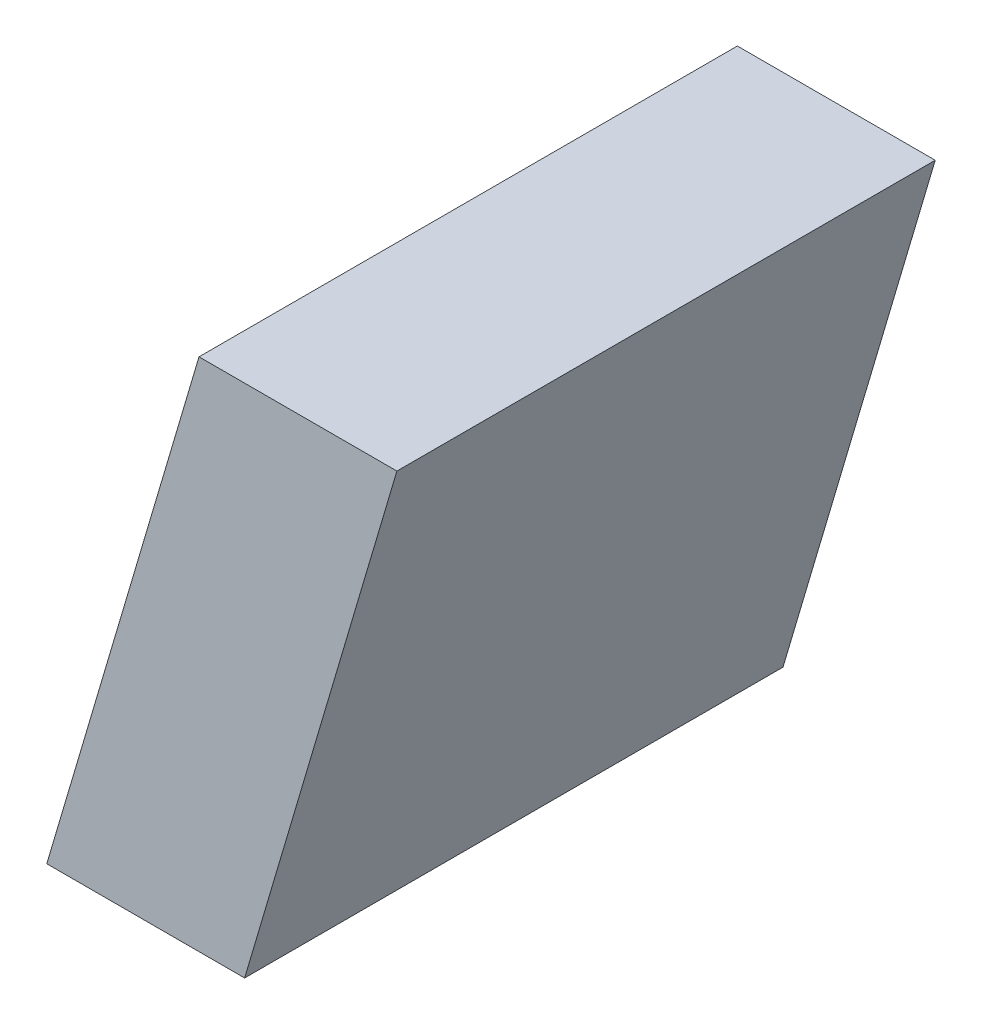
ISO-10303-21;
HEADER;
FILE_DESCRIPTION(('STEP AP214'),'2;1');
FILE_NAME('part.step','',(''),(''),'','','');
FILE_SCHEMA(('AUTOMOTIVE_DESIGN { 1 0 10303 214 1 1 1 1 }'));
ENDSEC;
DATA;
#1=APPLICATION_CONTEXT('core data for automotive mechanical design processes');
#2=APPLICATION_PROTOCOL_DEFINITION('international standard','automotive_design',2000,#1);
#3=PRODUCT_CONTEXT('',#1,'mechanical');
#4=PRODUCT('Part','Part','',(#3));
#5=PRODUCT_RELATED_PRODUCT_CATEGORY('part','',(#4));
#6=PRODUCT_DEFINITION_FORMATION('','',#4);
#7=PRODUCT_DEFINITION_CONTEXT('part definition',#1,'design');
#8=PRODUCT_DEFINITION('design','',#6,#7);
#9=PRODUCT_DEFINITION_SHAPE('','',#8);
#10=(LENGTH_UNIT() NAMED_UNIT(*) SI_UNIT(.MILLI.,.METRE.));
#11=(NAMED_UNIT(*) PLANE_ANGLE_UNIT() SI_UNIT($,.RADIAN.));
#12=(NAMED_UNIT(*) SI_UNIT($,.STERADIAN.) SOLID_ANGLE_UNIT());
#13=UNCERTAINTY_MEASURE_WITH_UNIT(LENGTH_MEASURE(1.E-05),#10,'distance_accuracy_value','');
#14=(GEOMETRIC_REPRESENTATION_CONTEXT(3) GLOBAL_UNCERTAINTY_ASSIGNED_CONTEXT((#13)) GLOBAL_UNIT_ASSIGNED_CONTEXT((#10,
#11,#12)) REPRESENTATION_CONTEXT('',''));
#15=CARTESIAN_POINT('',(0.,0.,0.));
#16=DIRECTION('',(0.,0.,1.));
#17=DIRECTION('',(1.,0.,0.));
#18=AXIS2_PLACEMENT_3D('',#15,#16,#17);
#19=CARTESIAN_POINT('',(-2.2657258471,-1.901525578586,0.));
#20=DIRECTION('',(0.,-1.,0.));
#21=DIRECTION('',(1.,0.,0.));
#22=AXIS2_PLACEMENT_3D('',#19,#20,#21);
#23=PLANE('',#22);
#24=DIRECTION('',(1.,0.,0.));
#25=VECTOR('',#24,1.);
#26=CARTESIAN_POINT('',(-2.2657258471,-1.901525578586,0.));
#27=LINE('',#26,#25);
#28=CARTESIAN_POINT('',(-2.2657258471,-1.901525578586,0.));
#29=VERTEX_POINT('',#28);
#30=CARTESIAN_POINT('',(-2.228971753874,-1.901525578586,0.));
#31=VERTEX_POINT('',#30);
#32=EDGE_CURVE('E11',#29,#31,#27,.T.);
#33=ORIENTED_EDGE('',*,*,#32,.T.);
#34=DIRECTION('',(0.,0.,1.));
#35=VECTOR('',#34,1.);
#36=CARTESIAN_POINT('',(-2.228971753874,-1.901525578586,0.));
#37=LINE('',#36,#35);
#38=CARTESIAN_POINT('',(-2.228971753874,-1.901525578586,0.1));
#39=VERTEX_POINT('',#38);
#40=EDGE_CURVE('E24',#31,#39,#37,.T.);
#41=ORIENTED_EDGE('',*,*,#40,.T.);
#42=DIRECTION('',(1.,0.,0.));
#43=VECTOR('',#42,1.);
#44=CARTESIAN_POINT('',(-2.2657258471,-1.901525578586,0.1));
#45=LINE('',#44,#43);
#46=CARTESIAN_POINT('',(-2.2657258471,-1.901525578586,0.1));
#47=VERTEX_POINT('',#46);
#48=EDGE_CURVE('E75',#47,#39,#45,.T.);
#49=ORIENTED_EDGE('',*,*,#48,.F.);
#50=DIRECTION('',(0.,0.,1.));
#51=VECTOR('',#50,1.);
#52=CARTESIAN_POINT('',(-2.2657258471,-1.901525578586,0.));
#53=LINE('',#52,#51);
#54=EDGE_CURVE('E86',#29,#47,#53,.T.);
#55=ORIENTED_EDGE('',*,*,#54,.F.);
#56=EDGE_LOOP('',(#33,#41,#49,#55));
#57=FACE_BOUND('',#56,.T.);
#58=ADVANCED_FACE('F17',(#57),#23,.T.);
#59=CARTESIAN_POINT('',(-2.237443986862,-1.805832154574,0.));
#60=DIRECTION('',(-0.958993732012229,0.283427278082505,0.));
#61=DIRECTION('',(-0.283427278082505,-0.958993732012229,0.));
#62=AXIS2_PLACEMENT_3D('',#59,#60,#61);
#63=PLANE('',#62);
#64=DIRECTION('',(-0.283427278082505,-0.958993732012229,0.));
#65=VECTOR('',#64,1.);
#66=CARTESIAN_POINT('',(-2.237443986862,-1.805832154574,0.));
#67=LINE('',#66,#65);
#68=CARTESIAN_POINT('',(-2.237443986862,-1.805832154574,0.));
#69=VERTEX_POINT('',#68);
#70=EDGE_CURVE('E83',#69,#29,#67,.T.);
#71=ORIENTED_EDGE('',*,*,#70,.T.);
#72=ORIENTED_EDGE('',*,*,#54,.T.);
#73=DIRECTION('',(-0.283427278082505,-0.958993732012229,0.));
#74=VECTOR('',#73,1.);
#75=CARTESIAN_POINT('',(-2.237443986862,-1.805832154574,0.1));
#76=LINE('',#75,#74);
#77=CARTESIAN_POINT('',(-2.237443986862,-1.805832154574,0.1));
#78=VERTEX_POINT('',#77);
#79=EDGE_CURVE('E81',#78,#47,#76,.T.);
#80=ORIENTED_EDGE('',*,*,#79,.F.);
#81=DIRECTION('',(0.,0.,1.));
#82=VECTOR('',#81,1.);
#83=CARTESIAN_POINT('',(-2.237443986862,-1.805832154574,0.));
#84=LINE('',#83,#82);
#85=EDGE_CURVE('E61',#69,#78,#84,.T.);
#86=ORIENTED_EDGE('',*,*,#85,.F.);
#87=EDGE_LOOP('',(#71,#72,#80,#86));
#88=FACE_BOUND('',#87,.T.);
#89=ADVANCED_FACE('F91',(#88),#63,.T.);
#90=CARTESIAN_POINT('',(-2.200689893635,-1.805832154574,0.));
#91=DIRECTION('',(0.,1.,0.));
#92=DIRECTION('',(-1.,0.,0.));
#93=AXIS2_PLACEMENT_3D('',#90,#91,#92);
#94=PLANE('',#93);
#95=DIRECTION('',(-1.,0.,0.));
#96=VECTOR('',#95,1.);
#97=CARTESIAN_POINT('',(-2.200689893635,-1.805832154574,0.));
#98=LINE('',#97,#96);
#99=CARTESIAN_POINT('',(-2.200689893635,-1.805832154574,0.));
#100=VERTEX_POINT('',#99);
#101=EDGE_CURVE('E65',#100,#69,#98,.T.);
#102=ORIENTED_EDGE('',*,*,#101,.T.);
#103=ORIENTED_EDGE('',*,*,#85,.T.);
#104=DIRECTION('',(-1.,0.,0.));
#105=VECTOR('',#104,1.);
#106=CARTESIAN_POINT('',(-2.200689893635,-1.805832154574,0.1));
#107=LINE('',#106,#105);
#108=CARTESIAN_POINT('',(-2.200689893635,-1.805832154574,0.1));
#109=VERTEX_POINT('',#108);
#110=EDGE_CURVE('E54',#109,#78,#107,.T.);
#111=ORIENTED_EDGE('',*,*,#110,.F.);
#112=DIRECTION('',(0.,0.,1.));
#113=VECTOR('',#112,1.);
#114=CARTESIAN_POINT('',(-2.200689893635,-1.805832154574,0.));
#115=LINE('',#114,#113);
#116=EDGE_CURVE('E58',#100,#109,#115,.T.);
#117=ORIENTED_EDGE('',*,*,#116,.F.);
#118=EDGE_LOOP('',(#102,#103,#111,#117));
#119=FACE_BOUND('',#118,.T.);
#120=ADVANCED_FACE('F57',(#119),#94,.T.);
#121=CARTESIAN_POINT('',(-2.228971753874,-1.901525578586,0.));
#122=DIRECTION('',(0.958993732012229,-0.283427278082505,0.));
#123=DIRECTION('',(0.283427278082505,0.958993732012229,0.));
#124=AXIS2_PLACEMENT_3D('',#121,#122,#123);
#125=PLANE('',#124);
#126=DIRECTION('',(0.283427278082505,0.958993732012229,0.));
#127=VECTOR('',#126,1.);
#128=CARTESIAN_POINT('',(-2.228971753874,-1.901525578586,0.));
#129=LINE('',#128,#127);
#130=EDGE_CURVE('E71',#31,#100,#129,.T.);
#131=ORIENTED_EDGE('',*,*,#130,.T.);
#132=ORIENTED_EDGE('',*,*,#116,.T.);
#133=DIRECTION('',(0.283427278082505,0.958993732012229,0.));
#134=VECTOR('',#133,1.);
#135=CARTESIAN_POINT('',(-2.228971753874,-1.901525578586,0.1));
#136=LINE('',#135,#134);
#137=EDGE_CURVE('E70',#39,#109,#136,.T.);
#138=ORIENTED_EDGE('',*,*,#137,.F.);
#139=ORIENTED_EDGE('',*,*,#40,.F.);
#140=EDGE_LOOP('',(#131,#132,#138,#139));
#141=FACE_BOUND('',#140,.T.);
#142=ADVANCED_FACE('F69',(#141),#125,.T.);
#143=CARTESIAN_POINT('',(-2.233207870368,-1.85367886658,0.1));
#144=DIRECTION('',(0.,0.,1.));
#145=DIRECTION('',(1.,0.,0.));
#146=AXIS2_PLACEMENT_3D('',#143,#144,#145);
#147=PLANE('',#146);
#148=ORIENTED_EDGE('',*,*,#137,.T.);
#149=ORIENTED_EDGE('',*,*,#110,.T.);
#150=ORIENTED_EDGE('',*,*,#79,.T.);
#151=ORIENTED_EDGE('',*,*,#48,.T.);
#152=EDGE_LOOP('',(#148,#149,#150,#151));
#153=FACE_BOUND('',#152,.T.);
#154=ADVANCED_FACE('F74',(#153),#147,.T.);
#155=CARTESIAN_POINT('',(-2.233207870368,-1.85367886658,0.));
#156=DIRECTION('',(0.,0.,1.));
#157=DIRECTION('',(1.,0.,0.));
#158=AXIS2_PLACEMENT_3D('',#155,#156,#157);
#159=PLANE('',#158);
#160=ORIENTED_EDGE('',*,*,#130,.F.);
#161=ORIENTED_EDGE('',*,*,#32,.F.);
#162=ORIENTED_EDGE('',*,*,#70,.F.);
#163=ORIENTED_EDGE('',*,*,#101,.F.);
#164=EDGE_LOOP('',(#160,#161,#162,#163));
#165=FACE_BOUND('',#164,.T.);
#166=ADVANCED_FACE('F89',(#165),#159,.F.);
#167=CLOSED_SHELL('',(#58,#89,#120,#142,#154,#166));
#168=MANIFOLD_SOLID_BREP('B1',#167);
#169=ADVANCED_BREP_SHAPE_REPRESENTATION('',(#18,#168),#14);
#170=SHAPE_DEFINITION_REPRESENTATION(#9,#169);
ENDSEC;
END-ISO-10303-21;
